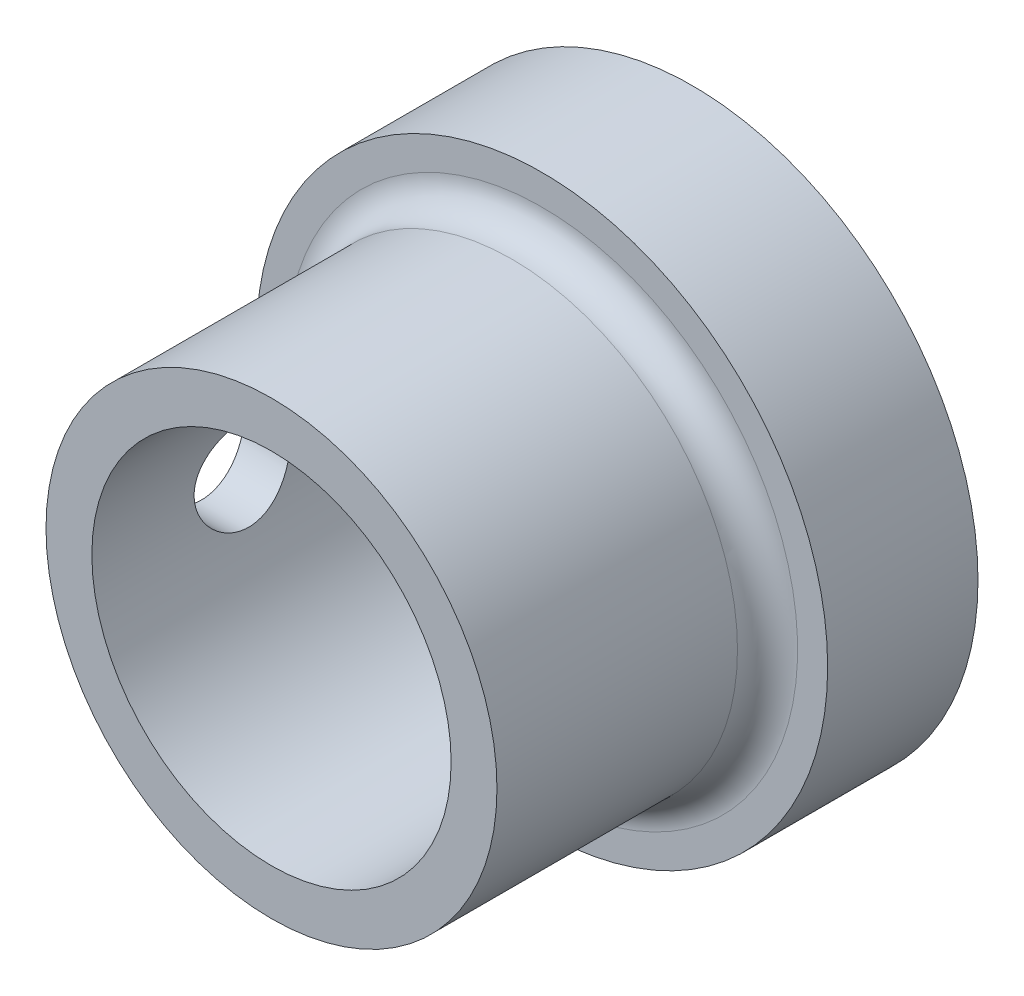
ISO-10303-21;
HEADER;
FILE_DESCRIPTION(('STEP AP214'),'2;1');
FILE_NAME('part.step','',(''),(''),'','','');
FILE_SCHEMA(('AUTOMOTIVE_DESIGN { 1 0 10303 214 1 1 1 1 }'));
ENDSEC;
DATA;
#1=APPLICATION_CONTEXT('core data for automotive mechanical design processes');
#2=APPLICATION_PROTOCOL_DEFINITION('international standard','automotive_design',2000,#1);
#3=PRODUCT_CONTEXT('',#1,'mechanical');
#4=PRODUCT('Part','Part','',(#3));
#5=PRODUCT_RELATED_PRODUCT_CATEGORY('part','',(#4));
#6=PRODUCT_DEFINITION_FORMATION('','',#4);
#7=PRODUCT_DEFINITION_CONTEXT('part definition',#1,'design');
#8=PRODUCT_DEFINITION('design','',#6,#7);
#9=PRODUCT_DEFINITION_SHAPE('','',#8);
#10=(LENGTH_UNIT() NAMED_UNIT(*) SI_UNIT(.MILLI.,.METRE.));
#11=(NAMED_UNIT(*) PLANE_ANGLE_UNIT() SI_UNIT($,.RADIAN.));
#12=(NAMED_UNIT(*) SI_UNIT($,.STERADIAN.) SOLID_ANGLE_UNIT());
#13=UNCERTAINTY_MEASURE_WITH_UNIT(LENGTH_MEASURE(1.E-05),#10,'distance_accuracy_value','');
#14=(GEOMETRIC_REPRESENTATION_CONTEXT(3) GLOBAL_UNCERTAINTY_ASSIGNED_CONTEXT((#13)) GLOBAL_UNIT_ASSIGNED_CONTEXT((#10,
#11,#12)) REPRESENTATION_CONTEXT('',''));
#15=CARTESIAN_POINT('',(0.,0.,0.));
#16=DIRECTION('',(0.,0.,1.));
#17=DIRECTION('',(1.,0.,0.));
#18=AXIS2_PLACEMENT_3D('',#15,#16,#17);
#19=CARTESIAN_POINT('',(0.,0.,9.));
#20=DIRECTION('',(0.,0.,1.));
#21=DIRECTION('',(1.,0.,0.));
#22=AXIS2_PLACEMENT_3D('',#19,#20,#21);
#23=PLANE('',#22);
#24=CARTESIAN_POINT('',(0.,0.,9.));
#25=DIRECTION('',(0.,0.,1.));
#26=DIRECTION('',(1.,0.,0.));
#27=AXIS2_PLACEMENT_3D('',#24,#25,#26);
#28=CIRCLE('',#27,7.5);
#29=CARTESIAN_POINT('',(7.5,0.,9.));
#30=VERTEX_POINT('',#29);
#31=EDGE_CURVE('E54',#30,#30,#28,.T.);
#32=ORIENTED_EDGE('',*,*,#31,.T.);
#33=EDGE_LOOP('',(#32));
#34=FACE_BOUND('',#33,.T.);
#35=CARTESIAN_POINT('',(0.,0.,9.));
#36=DIRECTION('',(0.,0.,1.));
#37=DIRECTION('',(1.,0.,0.));
#38=AXIS2_PLACEMENT_3D('',#35,#36,#37);
#39=CIRCLE('',#38,5.975);
#40=CARTESIAN_POINT('',(5.975,0.,9.));
#41=VERTEX_POINT('',#40);
#42=EDGE_CURVE('E59',#41,#41,#39,.T.);
#43=ORIENTED_EDGE('',*,*,#42,.F.);
#44=EDGE_LOOP('',(#43));
#45=FACE_BOUND('',#44,.T.);
#46=ADVANCED_FACE('F41',(#34,#45),#23,.T.);
#47=CARTESIAN_POINT('',(0.,0.,9.));
#48=DIRECTION('',(0.,0.,-1.));
#49=DIRECTION('',(-1.,0.,0.));
#50=AXIS2_PLACEMENT_3D('',#47,#48,#49);
#51=CYLINDRICAL_SURFACE('',#50,7.5);
#52=CARTESIAN_POINT('',(0.,0.,0.999999999999999));
#53=DIRECTION('',(0.,0.,-1.));
#54=DIRECTION('',(-1.,0.,0.));
#55=AXIS2_PLACEMENT_3D('',#52,#53,#54);
#56=CIRCLE('',#55,7.5);
#57=CARTESIAN_POINT('',(-7.5,0.,0.999999999999999));
#58=VERTEX_POINT('',#57);
#59=EDGE_CURVE('E49',#58,#58,#56,.F.);
#60=ORIENTED_EDGE('',*,*,#59,.T.);
#61=EDGE_LOOP('',(#60));
#62=FACE_BOUND('',#61,.T.);
#63=CARTESIAN_POINT('',(-7.5,0.,5.6));
#64=CARTESIAN_POINT('',(-7.4999983570598,-0.0887944293338555,5.59999689419536));
#65=CARTESIAN_POINT('',(-7.49840703800838,-0.177626889700681,5.59258336552044));
#66=CARTESIAN_POINT('',(-7.49221258982039,-0.352772204992273,5.56315376142797));
#67=CARTESIAN_POINT('',(-7.48760723719598,-0.439083150622767,5.54112690542328));
#68=CARTESIAN_POINT('',(-7.47589793294748,-0.60662858018066,5.48318904804614));
#69=CARTESIAN_POINT('',(-7.46879652810656,-0.687868139445261,5.44729219487858));
#70=CARTESIAN_POINT('',(-7.45286320133509,-0.843167757727071,5.36267739239734));
#71=CARTESIAN_POINT('',(-7.4440313413038,-0.91722807340792,5.31395990166309));
#72=CARTESIAN_POINT('',(-7.42545480782523,-1.05720419368928,5.20429716953458));
#73=CARTESIAN_POINT('',(-7.41569927510424,-1.12299434543086,5.14319336689695));
#74=CARTESIAN_POINT('',(-7.39645215099328,-1.24347351522622,5.010833063914));
#75=CARTESIAN_POINT('',(-7.38696058229821,-1.29816158128342,4.9395756937978));
#76=CARTESIAN_POINT('',(-7.36920930951561,-1.39543277767187,4.78800940494011));
#77=CARTESIAN_POINT('',(-7.36096353805546,-1.43788322502763,4.70761355668354));
#78=CARTESIAN_POINT('',(-7.34679287525929,-1.50862340101052,4.54062468310146));
#79=CARTESIAN_POINT('',(-7.34086772090353,-1.53691473453874,4.45403236140342));
#80=CARTESIAN_POINT('',(-7.33211955105285,-1.57812049535871,4.27846838088968));
#81=CARTESIAN_POINT('',(-7.32925182047022,-1.59125680705956,4.18955107459205));
#82=CARTESIAN_POINT('',(-7.32680881403605,-1.60246934089929,4.01073195584931));
#83=CARTESIAN_POINT('',(-7.32723315384411,-1.60054732105774,3.92083025955284));
#84=CARTESIAN_POINT('',(-7.33128581769295,-1.58187655808686,3.74423604448313));
#85=CARTESIAN_POINT('',(-7.33485865843677,-1.56538455643806,3.6575149158877));
#86=CARTESIAN_POINT('',(-7.34471814062502,-1.51844828834833,3.48809934830167));
#87=CARTESIAN_POINT('',(-7.35100492764819,-1.48800327344863,3.4054051255831));
#88=CARTESIAN_POINT('',(-7.36563922179753,-1.41378668233803,3.24566362655982));
#89=CARTESIAN_POINT('',(-7.37400204199821,-1.36991548636568,3.1686640952086));
#90=CARTESIAN_POINT('',(-7.39183660364213,-1.27016199217251,3.02302428677124));
#91=CARTESIAN_POINT('',(-7.40130848917848,-1.21427813244002,2.95438509825491));
#92=CARTESIAN_POINT('',(-7.4205326849195,-1.09072196751541,2.82593524608154));
#93=CARTESIAN_POINT('',(-7.43028675890513,-1.02283110172083,2.76633488213618));
#94=CARTESIAN_POINT('',(-7.44879883076769,-0.877908758701804,2.65933258631255));
#95=CARTESIAN_POINT('',(-7.45755681226393,-0.8008771312005,2.61193085502408));
#96=CARTESIAN_POINT('',(-7.4731161994162,-0.639610081827265,2.53062332499256));
#97=CARTESIAN_POINT('',(-7.47991375438739,-0.555360898326551,2.49674403771802));
#98=CARTESIAN_POINT('',(-7.49075760800742,-0.382188547319416,2.44368065879573));
#99=CARTESIAN_POINT('',(-7.49480428682212,-0.293266027489788,2.42449453653411));
#100=CARTESIAN_POINT('',(-7.49963667143352,-0.11507604655174,2.40166556981615));
#101=CARTESIAN_POINT('',(-7.50048267119555,-0.0258469966592133,2.39773530031401));
#102=CARTESIAN_POINT('',(-7.49898689492793,0.151992686527996,2.40475203121251));
#103=CARTESIAN_POINT('',(-7.49664532405204,0.240603359252844,2.41569807416565));
#104=CARTESIAN_POINT('',(-7.48907546339841,0.41374606238025,2.45191822521633));
#105=CARTESIAN_POINT('',(-7.48387736587364,0.498310863335298,2.47704254852517));
#106=CARTESIAN_POINT('',(-7.47117587533623,0.662026395792981,2.54074058388016));
#107=CARTESIAN_POINT('',(-7.46367229265062,0.741176681186475,2.5793154025379));
#108=CARTESIAN_POINT('',(-7.44704294085318,0.893011950773002,2.66942507461825));
#109=CARTESIAN_POINT('',(-7.43789638159133,0.965593659738479,2.72113002651483));
#110=CARTESIAN_POINT('',(-7.41903990869546,1.10115356003048,2.83580715603025));
#111=CARTESIAN_POINT('',(-7.40932992580373,1.16413056725131,2.8987807208118));
#112=CARTESIAN_POINT('',(-7.39023419815026,1.27982177561401,3.03552343962769));
#113=CARTESIAN_POINT('',(-7.38085708289827,1.33233743532724,3.10946199340809));
#114=CARTESIAN_POINT('',(-7.36368318738415,1.42420609305472,3.26527871151165));
#115=CARTESIAN_POINT('',(-7.35588633999514,1.46355965021716,3.34715653837054));
#116=CARTESIAN_POINT('',(-7.3428278116798,1.52772807228231,3.5160945750566));
#117=CARTESIAN_POINT('',(-7.33755218632522,1.55262307368944,3.6031232157705));
#118=CARTESIAN_POINT('',(-7.33010689029808,1.58740514879097,3.78025472587967));
#119=CARTESIAN_POINT('',(-7.32793675061545,1.59729448874882,3.87035712895102));
#120=CARTESIAN_POINT('',(-7.32697666157729,1.60169174862619,4.04907925727693));
#121=CARTESIAN_POINT('',(-7.32811760571581,1.59651412882043,4.13769102055621));
#122=CARTESIAN_POINT('',(-7.33349539816058,1.57162478005708,4.31274860255213));
#123=CARTESIAN_POINT('',(-7.33773221359929,1.55191320540032,4.39919444425336));
#124=CARTESIAN_POINT('',(-7.34879149338567,1.49866402761734,4.5672312446234));
#125=CARTESIAN_POINT('',(-7.35560579203591,1.46517005919756,4.64883660353434));
#126=CARTESIAN_POINT('',(-7.37105584436333,1.38534516691845,4.80531708369125));
#127=CARTESIAN_POINT('',(-7.37969177702726,1.33901298148491,4.8801915425531));
#128=CARTESIAN_POINT('',(-7.39801997202294,1.23377464987916,5.02263967744949));
#129=CARTESIAN_POINT('',(-7.40772937703983,1.17464349733652,5.09004494825338));
#130=CARTESIAN_POINT('',(-7.42699305436863,1.0459443480745,5.21407953214307));
#131=CARTESIAN_POINT('',(-7.43654729038956,0.976373947694452,5.27070635663727));
#132=CARTESIAN_POINT('',(-7.4545622712928,0.82774819396845,5.37223603945681));
#133=CARTESIAN_POINT('',(-7.46300824065792,0.748587403501142,5.41698730989109));
#134=CARTESIAN_POINT('',(-7.47770774713458,0.583706040029165,5.49247899855657));
#135=CARTESIAN_POINT('',(-7.48396316300769,0.497991165498192,5.52323142992907));
#136=CARTESIAN_POINT('',(-7.49243099511991,0.343464763103909,5.56422976291382));
#137=CARTESIAN_POINT('',(-7.4952520823403,0.275502835649662,5.57761851465133));
#138=CARTESIAN_POINT('',(-7.49903718747764,0.138368271279889,5.5955046639985));
#139=CARTESIAN_POINT('',(-7.5000012803097,0.0691956833185954,5.60000242029006));
#140=CARTESIAN_POINT('',(-7.5,0.,5.6));
#141=B_SPLINE_CURVE_WITH_KNOTS('',3,(#63,#64,#65,#66,#67,#68,#69,#70,#71,#72,#73,#74,#75,#76,
#77,#78,#79,#80,#81,#82,#83,#84,#85,#86,#87,#88,#89,#90,#91,#92,#93,#94,#95,#96,#97,#98,#99,
#100,#101,#102,#103,#104,#105,#106,#107,#108,#109,#110,#111,#112,#113,#114,#115,#116,#117,#118,
#119,#120,#121,#122,#123,#124,#125,#126,#127,#128,#129,#130,#131,#132,#133,#134,#135,#136,#137,
#138,#139,#140),.UNSPECIFIED.,.T.,.F.,(4,2,2,2,2,2,2,2,2,2,2,2,2,2,2,2,2,2,2,2,2,2,2,2,2,2,2,2,
2,2,2,2,2,2,2,2,2,2,4),(0.,0.266130047854763,0.532456644597193,0.798512286868045,
1.0645584139285,1.33425388789939,1.60397247832158,1.87651399120587,2.14902460517277,
2.41749263134366,2.68592931506412,2.94972810159234,3.21354104030559,3.47936093436643,
3.74521540295248,4.01653060252532,4.28785026321978,4.55969927797482,4.83151071607125,
5.09817555204362,5.36482322613615,5.62870529395038,5.89260907723843,6.16012360036749,
6.42767107713311,6.69989324302713,6.97210384299803,7.24279095265699,7.51343717712194,
7.77847555890145,8.04351112692155,8.30771397733335,8.57194279940304,8.84126112654219,
9.11064156026671,9.38331104903345,9.65574610257701,9.86314417471903,10.0705338798061),.UNSPECIFIED.);
#142=CARTESIAN_POINT('',(-7.5,0.,5.6));
#143=VERTEX_POINT('',#142);
#144=EDGE_CURVE('E70',#143,#143,#141,.T.);
#145=ORIENTED_EDGE('',*,*,#144,.T.);
#146=EDGE_LOOP('',(#145));
#147=FACE_BOUND('',#146,.T.);
#148=ORIENTED_EDGE('',*,*,#31,.F.);
#149=EDGE_LOOP('',(#148));
#150=FACE_BOUND('',#149,.T.);
#151=ADVANCED_FACE('F94',(#62,#147,#150),#51,.T.);
#152=CARTESIAN_POINT('',(0.,0.,9.));
#153=DIRECTION('',(0.,0.,-1.));
#154=DIRECTION('',(-1.,0.,0.));
#155=AXIS2_PLACEMENT_3D('',#152,#153,#154);
#156=CYLINDRICAL_SURFACE('',#155,5.975);
#157=CARTESIAN_POINT('',(-5.975,0.,5.6));
#158=CARTESIAN_POINT('',(-5.97499868415255,-0.0881900110692454,5.59999793510952));
#159=CARTESIAN_POINT('',(-5.9730282977211,-0.176402094677064,5.59268417749883));
#160=CARTESIAN_POINT('',(-5.96535942915311,-0.350284240400148,5.56367472333325));
#161=CARTESIAN_POINT('',(-5.95965917485652,-0.435953073912684,5.54197219022109));
#162=CARTESIAN_POINT('',(-5.945159584009,-0.602213732612921,5.48494202951173));
#163=CARTESIAN_POINT('',(-5.93636426310385,-0.682811977591548,5.44963205106221));
#164=CARTESIAN_POINT('',(-5.91660355586653,-0.836942569706711,5.36645497110491));
#165=CARTESIAN_POINT('',(-5.9056380201196,-0.910474429819297,5.31858700493198));
#166=CARTESIAN_POINT('',(-5.88243386553063,-1.05010294255253,5.21047205345665));
#167=CARTESIAN_POINT('',(-5.87017334387803,-1.11601097817936,5.14998616917978));
#168=CARTESIAN_POINT('',(-5.84590137018246,-1.23687943535299,5.01886299622487));
#169=CARTESIAN_POINT('',(-5.83388995067085,-1.29183843498196,4.94822439109194));
#170=CARTESIAN_POINT('',(-5.8112518713116,-1.39017069775372,4.79729253040966));
#171=CARTESIAN_POINT('',(-5.80065283284142,-1.43332655359572,4.71685311011038));
#172=CARTESIAN_POINT('',(-5.78236177926086,-1.50542700968735,4.54953051887827));
#173=CARTESIAN_POINT('',(-5.77466922318516,-1.53437425479686,4.46264855066115));
#174=CARTESIAN_POINT('',(-5.76328831428228,-1.57657992344239,4.28699699530366));
#175=CARTESIAN_POINT('',(-5.75951279048406,-1.59018050875977,4.19831540903498));
#176=CARTESIAN_POINT('',(-5.75613301723131,-1.602373583181,4.01985510044102));
#177=CARTESIAN_POINT('',(-5.75652798129249,-1.60096890202669,3.9300765881673));
#178=CARTESIAN_POINT('',(-5.76136656204662,-1.58346286713118,3.75464504239624));
#179=CARTESIAN_POINT('',(-5.76569599098606,-1.56777599374954,3.66894699759883));
#180=CARTESIAN_POINT('',(-5.77773278787763,-1.52281489518971,3.5014458920747));
#181=CARTESIAN_POINT('',(-5.78544042781777,-1.49353957596136,3.41964314555601));
#182=CARTESIAN_POINT('',(-5.8034652993757,-1.42189590666076,3.26117644843259));
#183=CARTESIAN_POINT('',(-5.81381118103854,-1.37938259899528,3.18458143044669));
#184=CARTESIAN_POINT('',(-5.83593146687028,-1.28257086360373,3.03946706002226));
#185=CARTESIAN_POINT('',(-5.84770615416064,-1.22827009847589,2.97094931343573));
#186=CARTESIAN_POINT('',(-5.87183226227163,-1.10730750539673,2.84156688847954));
#187=CARTESIAN_POINT('',(-5.88418991192507,-1.04029774484115,2.78102820093671));
#188=CARTESIAN_POINT('',(-5.90774225856996,-0.896925961116779,2.67198057153981));
#189=CARTESIAN_POINT('',(-5.91893690895415,-0.820563563407598,2.62347211168971));
#190=CARTESIAN_POINT('',(-5.93897174282995,-0.660146555451302,2.53971670654054));
#191=CARTESIAN_POINT('',(-5.94780132777343,-0.576059514418465,2.50452917471775));
#192=CARTESIAN_POINT('',(-5.96203458213496,-0.402872866065846,2.44888398155992));
#193=CARTESIAN_POINT('',(-5.9674390066251,-0.313774368233654,2.42842307362514));
#194=CARTESIAN_POINT('',(-5.97409865195564,-0.135875710066537,2.40332476180017));
#195=CARTESIAN_POINT('',(-5.97547004528692,-0.0471423267673303,2.39824419302509));
#196=CARTESIAN_POINT('',(-5.97424332850474,0.129908773354865,2.40282634297281));
#197=CARTESIAN_POINT('',(-5.97164563237835,0.21822653256486,2.41248752408994));
#198=CARTESIAN_POINT('',(-5.96284768818735,0.390354763834245,2.44591557908444));
#199=CARTESIAN_POINT('',(-5.95671070436726,0.474216843096226,2.4694348969812));
#200=CARTESIAN_POINT('',(-5.94153070894882,0.636796780981881,2.52962379609045));
#201=CARTESIAN_POINT('',(-5.93248738110935,0.715514078676479,2.56629480839741));
#202=CARTESIAN_POINT('',(-5.91222606949092,0.867289046659958,2.65256564222908));
#203=CARTESIAN_POINT('',(-5.90096873447933,0.940204575860827,2.70240605681396));
#204=CARTESIAN_POINT('',(-5.87758051780046,1.07679257732217,2.8132987744858));
#205=CARTESIAN_POINT('',(-5.86544946238064,1.14046320345849,2.87435331143412));
#206=CARTESIAN_POINT('',(-5.84125301578481,1.25862419377201,3.00800984205346));
#207=CARTESIAN_POINT('',(-5.82919931535821,1.31280178175154,3.08089098263358));
#208=CARTESIAN_POINT('',(-5.80690137915833,1.40816507398682,3.234965505041));
#209=CARTESIAN_POINT('',(-5.79665706841525,1.44935131657819,3.31615854225504));
#210=CARTESIAN_POINT('',(-5.77925579941965,1.51725300869062,3.48415021182481));
#211=CARTESIAN_POINT('',(-5.77208108067626,1.54405193886458,3.57091316219165));
#212=CARTESIAN_POINT('',(-5.76162874555976,1.58261364603719,3.74793903988414));
#213=CARTESIAN_POINT('',(-5.75835012308746,1.59438030491771,3.83820105741678));
#214=CARTESIAN_POINT('',(-5.7561457380975,1.60231880889764,4.01645923574439));
#215=CARTESIAN_POINT('',(-5.75707959160408,1.59899357954463,4.10443159728808));
#216=CARTESIAN_POINT('',(-5.76286597412189,1.57801038549722,4.27851200971242));
#217=CARTESIAN_POINT('',(-5.76771840068404,1.56035279551495,4.3646201092728));
#218=CARTESIAN_POINT('',(-5.78071127060461,1.51149880967361,4.53188875601131));
#219=CARTESIAN_POINT('',(-5.7888255931901,1.48040982599077,4.61308284684533));
#220=CARTESIAN_POINT('',(-5.80742841572606,1.40565894750698,4.76916424957797));
#221=CARTESIAN_POINT('',(-5.81791729088843,1.36199506540241,4.84405056219239));
#222=CARTESIAN_POINT('',(-5.84047591247318,1.2618131847046,4.98778917050055));
#223=CARTESIAN_POINT('',(-5.85258331556351,1.2049523956314,5.05639667046));
#224=CARTESIAN_POINT('',(-5.87680542214124,1.0806415832521,5.18325958988717));
#225=CARTESIAN_POINT('',(-5.88892012668852,1.01318898404922,5.2415124837789));
#226=CARTESIAN_POINT('',(-5.91210515562988,0.867849148803367,5.34725154555391));
#227=CARTESIAN_POINT('',(-5.92314722782992,0.789767797032246,5.3944776233945));
#228=CARTESIAN_POINT('',(-5.94263296250955,0.626480947331723,5.47505883851365));
#229=CARTESIAN_POINT('',(-5.95107827751937,0.541280024264124,5.50842280216465));
#230=CARTESIAN_POINT('',(-5.96333788177867,0.380340032065255,5.55602341417533));
#231=CARTESIAN_POINT('',(-5.9676791752032,0.305289111137196,5.57247613673315));
#232=CARTESIAN_POINT('',(-5.97351066360611,0.153497586542737,5.59446477940263));
#233=CARTESIAN_POINT('',(-5.97500114526241,0.0767571535589497,5.60000179720032));
#234=CARTESIAN_POINT('',(-5.975,0.,5.6));
#235=B_SPLINE_CURVE_WITH_KNOTS('',3,(#157,#158,#159,#160,#161,#162,#163,#164,#165,#166,#167,
#168,#169,#170,#171,#172,#173,#174,#175,#176,#177,#178,#179,#180,#181,#182,#183,#184,#185,#186,
#187,#188,#189,#190,#191,#192,#193,#194,#195,#196,#197,#198,#199,#200,#201,#202,#203,#204,#205,
#206,#207,#208,#209,#210,#211,#212,#213,#214,#215,#216,#217,#218,#219,#220,#221,#222,#223,#224,
#225,#226,#227,#228,#229,#230,#231,#232,#233,#234),.UNSPECIFIED.,.T.,.F.,(4,2,2,2,2,2,2,2,2,2,2,
2,2,2,2,2,2,2,2,2,2,2,2,2,2,2,2,2,2,2,2,2,2,2,2,2,2,2,4),(0.,0.264288530574829,
0.528702722972186,0.792775112525281,1.0568656892395,1.32650342494611,1.59617615488699,
1.8705247261324,2.14482220941592,2.41287516677043,2.68087757472073,2.94134195572207,
3.20182731119995,3.46527175371963,3.72876848392908,4.00093513595112,4.27311269086086,
4.54649028633373,4.81980759509594,5.08517085803109,5.35050644472893,5.61124003955315,
5.87200201457427,6.13790388824399,6.40385878732021,6.67738140321674,6.95089268338844,
7.22279930788103,7.49463570194246,7.75748112039879,8.02031966711941,8.28109408571728,
8.54190973904966,8.81045989339088,9.0790754597732,9.35350020519376,9.62774994839155,
9.85779953515691,10.0878259868973),.UNSPECIFIED.);
#236=CARTESIAN_POINT('',(-5.975,0.,5.6));
#237=VERTEX_POINT('',#236);
#238=EDGE_CURVE('E62',#237,#237,#235,.T.);
#239=ORIENTED_EDGE('',*,*,#238,.F.);
#240=EDGE_LOOP('',(#239));
#241=FACE_BOUND('',#240,.T.);
#242=ORIENTED_EDGE('',*,*,#42,.T.);
#243=EDGE_LOOP('',(#242));
#244=FACE_BOUND('',#243,.T.);
#245=CARTESIAN_POINT('',(0.,0.,-5.));
#246=DIRECTION('',(0.,0.,1.));
#247=DIRECTION('',(1.,0.,0.));
#248=AXIS2_PLACEMENT_3D('',#245,#246,#247);
#249=CIRCLE('',#248,5.975);
#250=CARTESIAN_POINT('',(5.975,0.,-5.));
#251=VERTEX_POINT('',#250);
#252=EDGE_CURVE('E92',#251,#251,#249,.T.);
#253=ORIENTED_EDGE('',*,*,#252,.F.);
#254=EDGE_LOOP('',(#253));
#255=FACE_BOUND('',#254,.T.);
#256=ADVANCED_FACE('F72',(#241,#244,#255),#156,.F.);
#257=CARTESIAN_POINT('',(0.,0.,-5.));
#258=DIRECTION('',(0.,0.,1.));
#259=DIRECTION('',(1.,0.,0.));
#260=AXIS2_PLACEMENT_3D('',#257,#258,#259);
#261=CYLINDRICAL_SURFACE('',#260,9.5);
#262=CARTESIAN_POINT('',(0.,0.,-5.));
#263=DIRECTION('',(0.,0.,-1.));
#264=DIRECTION('',(-1.,0.,0.));
#265=AXIS2_PLACEMENT_3D('',#262,#263,#264);
#266=CIRCLE('',#265,9.5);
#267=CARTESIAN_POINT('',(-9.5,0.,-5.));
#268=VERTEX_POINT('',#267);
#269=EDGE_CURVE('E107',#268,#268,#266,.T.);
#270=ORIENTED_EDGE('',*,*,#269,.F.);
#271=EDGE_LOOP('',(#270));
#272=FACE_BOUND('',#271,.T.);
#273=CARTESIAN_POINT('',(0.,0.,0.));
#274=DIRECTION('',(0.,0.,-1.));
#275=DIRECTION('',(-1.,0.,0.));
#276=AXIS2_PLACEMENT_3D('',#273,#274,#275);
#277=CIRCLE('',#276,9.5);
#278=CARTESIAN_POINT('',(-9.5,0.,0.));
#279=VERTEX_POINT('',#278);
#280=EDGE_CURVE('E110',#279,#279,#277,.T.);
#281=ORIENTED_EDGE('',*,*,#280,.T.);
#282=EDGE_LOOP('',(#281));
#283=FACE_BOUND('',#282,.T.);
#284=ADVANCED_FACE('F123',(#272,#283),#261,.T.);
#285=CARTESIAN_POINT('',(0.,0.,-5.));
#286=DIRECTION('',(0.,0.,-1.));
#287=DIRECTION('',(-1.,0.,0.));
#288=AXIS2_PLACEMENT_3D('',#285,#286,#287);
#289=PLANE('',#288);
#290=ORIENTED_EDGE('',*,*,#252,.T.);
#291=EDGE_LOOP('',(#290));
#292=FACE_BOUND('',#291,.T.);
#293=ORIENTED_EDGE('',*,*,#269,.T.);
#294=EDGE_LOOP('',(#293));
#295=FACE_BOUND('',#294,.T.);
#296=ADVANCED_FACE('F82',(#292,#295),#289,.T.);
#297=CARTESIAN_POINT('',(0.,0.,0.));
#298=DIRECTION('',(0.,0.,-1.));
#299=DIRECTION('',(-1.,0.,0.));
#300=AXIS2_PLACEMENT_3D('',#297,#298,#299);
#301=PLANE('',#300);
#302=CARTESIAN_POINT('',(0.,0.,0.));
#303=DIRECTION('',(0.,0.,-1.));
#304=DIRECTION('',(-1.,0.,0.));
#305=AXIS2_PLACEMENT_3D('',#302,#303,#304);
#306=CIRCLE('',#305,8.5);
#307=CARTESIAN_POINT('',(-8.5,0.,0.));
#308=VERTEX_POINT('',#307);
#309=EDGE_CURVE('E10',#308,#308,#306,.T.);
#310=ORIENTED_EDGE('',*,*,#309,.T.);
#311=EDGE_LOOP('',(#310));
#312=FACE_BOUND('',#311,.T.);
#313=ORIENTED_EDGE('',*,*,#280,.F.);
#314=EDGE_LOOP('',(#313));
#315=FACE_BOUND('',#314,.T.);
#316=ADVANCED_FACE('F80',(#312,#315),#301,.F.);
#317=CARTESIAN_POINT('',(4.5,0.,4.));
#318=DIRECTION('',(-1.,0.,0.));
#319=DIRECTION('',(0.,0.,1.));
#320=AXIS2_PLACEMENT_3D('',#317,#318,#319);
#321=CYLINDRICAL_SURFACE('',#320,1.6);
#322=ORIENTED_EDGE('',*,*,#238,.T.);
#323=EDGE_LOOP('',(#322));
#324=FACE_BOUND('',#323,.T.);
#325=ORIENTED_EDGE('',*,*,#144,.F.);
#326=EDGE_LOOP('',(#325));
#327=FACE_BOUND('',#326,.T.);
#328=ADVANCED_FACE('F76',(#324,#327),#321,.F.);
#329=CARTESIAN_POINT('',(0.,0.,0.999999999999999));
#330=DIRECTION('',(0.,0.,-1.));
#331=DIRECTION('',(-1.,0.,0.));
#332=AXIS2_PLACEMENT_3D('',#329,#330,#331);
#333=TOROIDAL_SURFACE('',#332,8.5,1.);
#334=ORIENTED_EDGE('',*,*,#309,.F.);
#335=EDGE_LOOP('',(#334));
#336=FACE_BOUND('',#335,.T.);
#337=ORIENTED_EDGE('',*,*,#59,.F.);
#338=EDGE_LOOP('',(#337));
#339=FACE_BOUND('',#338,.T.);
#340=ADVANCED_FACE('F43',(#336,#339),#333,.F.);
#341=CLOSED_SHELL('',(#46,#151,#256,#284,#296,#316,#328,#340));
#342=MANIFOLD_SOLID_BREP('B2',#341);
#343=ADVANCED_BREP_SHAPE_REPRESENTATION('',(#18,#342),#14);
#344=SHAPE_DEFINITION_REPRESENTATION(#9,#343);
ENDSEC;
END-ISO-10303-21;
